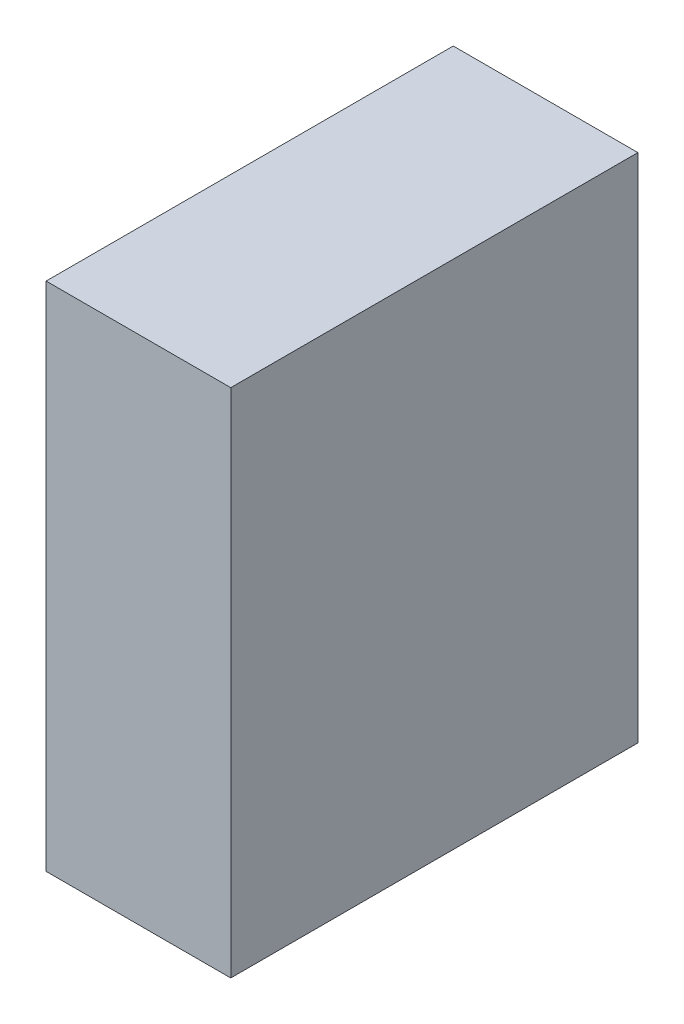
ISO-10303-21;
HEADER;
FILE_DESCRIPTION(('STEP AP214'),'2;1');
FILE_NAME('part.step','',(''),(''),'','','');
FILE_SCHEMA(('AUTOMOTIVE_DESIGN { 1 0 10303 214 1 1 1 1 }'));
ENDSEC;
DATA;
#1=APPLICATION_CONTEXT('core data for automotive mechanical design processes');
#2=APPLICATION_PROTOCOL_DEFINITION('international standard','automotive_design',2000,#1);
#3=PRODUCT_CONTEXT('',#1,'mechanical');
#4=PRODUCT('Part','Part','',(#3));
#5=PRODUCT_RELATED_PRODUCT_CATEGORY('part','',(#4));
#6=PRODUCT_DEFINITION_FORMATION('','',#4);
#7=PRODUCT_DEFINITION_CONTEXT('part definition',#1,'design');
#8=PRODUCT_DEFINITION('design','',#6,#7);
#9=PRODUCT_DEFINITION_SHAPE('','',#8);
#10=(LENGTH_UNIT() NAMED_UNIT(*) SI_UNIT(.MILLI.,.METRE.));
#11=(NAMED_UNIT(*) PLANE_ANGLE_UNIT() SI_UNIT($,.RADIAN.));
#12=(NAMED_UNIT(*) SI_UNIT($,.STERADIAN.) SOLID_ANGLE_UNIT());
#13=UNCERTAINTY_MEASURE_WITH_UNIT(LENGTH_MEASURE(1.E-05),#10,'distance_accuracy_value','');
#14=(GEOMETRIC_REPRESENTATION_CONTEXT(3) GLOBAL_UNCERTAINTY_ASSIGNED_CONTEXT((#13)) GLOBAL_UNIT_ASSIGNED_CONTEXT((#10,
#11,#12)) REPRESENTATION_CONTEXT('',''));
#15=CARTESIAN_POINT('',(0.,0.,0.));
#16=DIRECTION('',(0.,0.,1.));
#17=DIRECTION('',(1.,0.,0.));
#18=AXIS2_PLACEMENT_3D('',#15,#16,#17);
#19=CARTESIAN_POINT('',(78.,57.7834394904458,414.802547770701));
#20=DIRECTION('',(0.,0.,-1.));
#21=DIRECTION('',(-1.,0.,0.));
#22=AXIS2_PLACEMENT_3D('',#19,#20,#21);
#23=PLANE('',#22);
#24=DIRECTION('',(0.,-1.,0.));
#25=VECTOR('',#24,1.);
#26=CARTESIAN_POINT('',(0.,57.7834394904458,414.802547770701));
#27=LINE('',#26,#25);
#28=CARTESIAN_POINT('',(0.,57.7834394904458,414.802547770701));
#29=VERTEX_POINT('',#28);
#30=CARTESIAN_POINT('',(0.,-158.216560509554,414.802547770701));
#31=VERTEX_POINT('',#30);
#32=EDGE_CURVE('E113',#29,#31,#27,.T.);
#33=ORIENTED_EDGE('',*,*,#32,.T.);
#34=DIRECTION('',(-1.,0.,0.));
#35=VECTOR('',#34,1.);
#36=CARTESIAN_POINT('',(78.,-158.216560509554,414.802547770701));
#37=LINE('',#36,#35);
#38=CARTESIAN_POINT('',(78.,-158.216560509554,414.802547770701));
#39=VERTEX_POINT('',#38);
#40=EDGE_CURVE('E11',#39,#31,#37,.T.);
#41=ORIENTED_EDGE('',*,*,#40,.F.);
#42=DIRECTION('',(0.,-1.,0.));
#43=VECTOR('',#42,1.);
#44=CARTESIAN_POINT('',(78.,57.7834394904458,414.802547770701));
#45=LINE('',#44,#43);
#46=CARTESIAN_POINT('',(78.,57.7834394904458,414.802547770701));
#47=VERTEX_POINT('',#46);
#48=EDGE_CURVE('E97',#47,#39,#45,.T.);
#49=ORIENTED_EDGE('',*,*,#48,.F.);
#50=DIRECTION('',(-1.,0.,0.));
#51=VECTOR('',#50,1.);
#52=CARTESIAN_POINT('',(78.,57.7834394904458,414.802547770701));
#53=LINE('',#52,#51);
#54=EDGE_CURVE('E109',#47,#29,#53,.T.);
#55=ORIENTED_EDGE('',*,*,#54,.T.);
#56=EDGE_LOOP('',(#33,#41,#49,#55));
#57=FACE_BOUND('',#56,.T.);
#58=ADVANCED_FACE('F45',(#57),#23,.F.);
#59=CARTESIAN_POINT('',(78.,-158.216560509554,414.802547770701));
#60=DIRECTION('',(0.,1.,0.));
#61=DIRECTION('',(0.,0.,1.));
#62=AXIS2_PLACEMENT_3D('',#59,#60,#61);
#63=PLANE('',#62);
#64=DIRECTION('',(0.,0.,-1.));
#65=VECTOR('',#64,1.);
#66=CARTESIAN_POINT('',(0.,-158.216560509554,414.802547770701));
#67=LINE('',#66,#65);
#68=CARTESIAN_POINT('',(0.,-158.216560509554,242.802547770701));
#69=VERTEX_POINT('',#68);
#70=EDGE_CURVE('E102',#31,#69,#67,.T.);
#71=ORIENTED_EDGE('',*,*,#70,.T.);
#72=DIRECTION('',(-1.,0.,0.));
#73=VECTOR('',#72,1.);
#74=CARTESIAN_POINT('',(78.,-158.216560509554,242.802547770701));
#75=LINE('',#74,#73);
#76=CARTESIAN_POINT('',(78.,-158.216560509554,242.802547770701));
#77=VERTEX_POINT('',#76);
#78=EDGE_CURVE('E54',#77,#69,#75,.T.);
#79=ORIENTED_EDGE('',*,*,#78,.F.);
#80=DIRECTION('',(0.,0.,-1.));
#81=VECTOR('',#80,1.);
#82=CARTESIAN_POINT('',(78.,-158.216560509554,414.802547770701));
#83=LINE('',#82,#81);
#84=EDGE_CURVE('E92',#39,#77,#83,.T.);
#85=ORIENTED_EDGE('',*,*,#84,.F.);
#86=ORIENTED_EDGE('',*,*,#40,.T.);
#87=EDGE_LOOP('',(#71,#79,#85,#86));
#88=FACE_BOUND('',#87,.T.);
#89=ADVANCED_FACE('F101',(#88),#63,.F.);
#90=CARTESIAN_POINT('',(78.,57.7834394904458,242.802547770701));
#91=DIRECTION('',(0.,0.,1.));
#92=DIRECTION('',(0.,-1.,0.));
#93=AXIS2_PLACEMENT_3D('',#90,#91,#92);
#94=PLANE('',#93);
#95=DIRECTION('',(0.,1.,0.));
#96=VECTOR('',#95,1.);
#97=CARTESIAN_POINT('',(0.,57.7834394904458,242.802547770701));
#98=LINE('',#97,#96);
#99=CARTESIAN_POINT('',(0.,57.7834394904458,242.802547770701));
#100=VERTEX_POINT('',#99);
#101=EDGE_CURVE('E79',#69,#100,#98,.T.);
#102=ORIENTED_EDGE('',*,*,#101,.T.);
#103=DIRECTION('',(-1.,0.,0.));
#104=VECTOR('',#103,1.);
#105=CARTESIAN_POINT('',(78.,57.7834394904458,242.802547770701));
#106=LINE('',#105,#104);
#107=CARTESIAN_POINT('',(78.,57.7834394904458,242.802547770701));
#108=VERTEX_POINT('',#107);
#109=EDGE_CURVE('E104',#108,#100,#106,.T.);
#110=ORIENTED_EDGE('',*,*,#109,.F.);
#111=DIRECTION('',(0.,1.,0.));
#112=VECTOR('',#111,1.);
#113=CARTESIAN_POINT('',(78.,57.7834394904458,242.802547770701));
#114=LINE('',#113,#112);
#115=EDGE_CURVE('E95',#77,#108,#114,.T.);
#116=ORIENTED_EDGE('',*,*,#115,.F.);
#117=ORIENTED_EDGE('',*,*,#78,.T.);
#118=EDGE_LOOP('',(#102,#110,#116,#117));
#119=FACE_BOUND('',#118,.T.);
#120=ADVANCED_FACE('F105',(#119),#94,.F.);
#121=CARTESIAN_POINT('',(78.,57.7834394904458,414.802547770701));
#122=DIRECTION('',(0.,-1.,0.));
#123=DIRECTION('',(0.,0.,-1.));
#124=AXIS2_PLACEMENT_3D('',#121,#122,#123);
#125=PLANE('',#124);
#126=DIRECTION('',(0.,0.,1.));
#127=VECTOR('',#126,1.);
#128=CARTESIAN_POINT('',(0.,57.7834394904458,414.802547770701));
#129=LINE('',#128,#127);
#130=EDGE_CURVE('E85',#100,#29,#129,.T.);
#131=ORIENTED_EDGE('',*,*,#130,.T.);
#132=ORIENTED_EDGE('',*,*,#54,.F.);
#133=DIRECTION('',(0.,0.,1.));
#134=VECTOR('',#133,1.);
#135=CARTESIAN_POINT('',(78.,57.7834394904458,414.802547770701));
#136=LINE('',#135,#134);
#137=EDGE_CURVE('E62',#108,#47,#136,.T.);
#138=ORIENTED_EDGE('',*,*,#137,.F.);
#139=ORIENTED_EDGE('',*,*,#109,.T.);
#140=EDGE_LOOP('',(#131,#132,#138,#139));
#141=FACE_BOUND('',#140,.T.);
#142=ADVANCED_FACE('F126',(#141),#125,.F.);
#143=CARTESIAN_POINT('',(78.,0.,0.));
#144=DIRECTION('',(1.,0.,0.));
#145=DIRECTION('',(0.,0.,-1.));
#146=AXIS2_PLACEMENT_3D('',#143,#144,#145);
#147=PLANE('',#146);
#148=ORIENTED_EDGE('',*,*,#48,.T.);
#149=ORIENTED_EDGE('',*,*,#84,.T.);
#150=ORIENTED_EDGE('',*,*,#115,.T.);
#151=ORIENTED_EDGE('',*,*,#137,.T.);
#152=EDGE_LOOP('',(#148,#149,#150,#151));
#153=FACE_BOUND('',#152,.T.);
#154=ADVANCED_FACE('F93',(#153),#147,.T.);
#155=CARTESIAN_POINT('',(0.,0.,0.));
#156=DIRECTION('',(1.,0.,0.));
#157=DIRECTION('',(0.,0.,-1.));
#158=AXIS2_PLACEMENT_3D('',#155,#156,#157);
#159=PLANE('',#158);
#160=ORIENTED_EDGE('',*,*,#32,.F.);
#161=ORIENTED_EDGE('',*,*,#130,.F.);
#162=ORIENTED_EDGE('',*,*,#101,.F.);
#163=ORIENTED_EDGE('',*,*,#70,.F.);
#164=EDGE_LOOP('',(#160,#161,#162,#163));
#165=FACE_BOUND('',#164,.T.);
#166=ADVANCED_FACE('F129',(#165),#159,.F.);
#167=CLOSED_SHELL('',(#58,#89,#120,#142,#154,#166));
#168=MANIFOLD_SOLID_BREP('B2',#167);
#169=ADVANCED_BREP_SHAPE_REPRESENTATION('',(#18,#168),#14);
#170=SHAPE_DEFINITION_REPRESENTATION(#9,#169);
ENDSEC;
END-ISO-10303-21;
